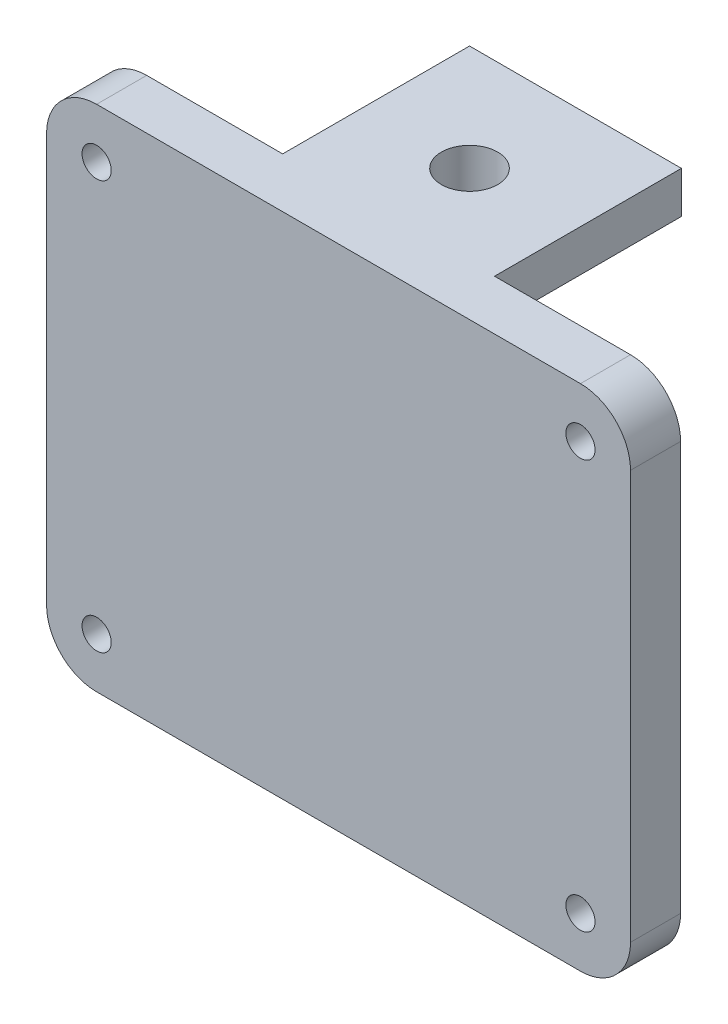
ISO-10303-21;
HEADER;
FILE_DESCRIPTION(('STEP AP214'),'2;1');
FILE_NAME('part.step','',(''),(''),'','','');
FILE_SCHEMA(('AUTOMOTIVE_DESIGN { 1 0 10303 214 1 1 1 1 }'));
ENDSEC;
DATA;
#1=APPLICATION_CONTEXT('core data for automotive mechanical design processes');
#2=APPLICATION_PROTOCOL_DEFINITION('international standard','automotive_design',2000,#1);
#3=PRODUCT_CONTEXT('',#1,'mechanical');
#4=PRODUCT('Part','Part','',(#3));
#5=PRODUCT_RELATED_PRODUCT_CATEGORY('part','',(#4));
#6=PRODUCT_DEFINITION_FORMATION('','',#4);
#7=PRODUCT_DEFINITION_CONTEXT('part definition',#1,'design');
#8=PRODUCT_DEFINITION('design','',#6,#7);
#9=PRODUCT_DEFINITION_SHAPE('','',#8);
#10=(LENGTH_UNIT() NAMED_UNIT(*) SI_UNIT(.MILLI.,.METRE.));
#11=(NAMED_UNIT(*) PLANE_ANGLE_UNIT() SI_UNIT($,.RADIAN.));
#12=(NAMED_UNIT(*) SI_UNIT($,.STERADIAN.) SOLID_ANGLE_UNIT());
#13=UNCERTAINTY_MEASURE_WITH_UNIT(LENGTH_MEASURE(1.E-05),#10,'distance_accuracy_value','');
#14=(GEOMETRIC_REPRESENTATION_CONTEXT(3) GLOBAL_UNCERTAINTY_ASSIGNED_CONTEXT((#13)) GLOBAL_UNIT_ASSIGNED_CONTEXT((#10,
#11,#12)) REPRESENTATION_CONTEXT('',''));
#15=CARTESIAN_POINT('',(0.,0.,0.));
#16=DIRECTION('',(0.,0.,1.));
#17=DIRECTION('',(1.,0.,0.));
#18=AXIS2_PLACEMENT_3D('',#15,#16,#17);
#19=CARTESIAN_POINT('',(12.7,5.,-12.7));
#20=DIRECTION('',(-1.,0.,0.));
#21=DIRECTION('',(0.,0.,1.));
#22=AXIS2_PLACEMENT_3D('',#19,#20,#21);
#23=PLANE('',#22);
#24=DIRECTION('',(0.,1.,0.));
#25=VECTOR('',#24,1.);
#26=CARTESIAN_POINT('',(12.7,5.,9.7));
#27=LINE('',#26,#25);
#28=CARTESIAN_POINT('',(12.7,0.,9.7));
#29=VERTEX_POINT('',#28);
#30=CARTESIAN_POINT('',(12.7,5.,9.7));
#31=VERTEX_POINT('',#30);
#32=EDGE_CURVE('E152',#29,#31,#27,.T.);
#33=ORIENTED_EDGE('',*,*,#32,.F.);
#34=DIRECTION('',(0.,0.,-1.));
#35=VECTOR('',#34,1.);
#36=CARTESIAN_POINT('',(12.7,0.,-12.7));
#37=LINE('',#36,#35);
#38=CARTESIAN_POINT('',(12.7,0.,-12.7));
#39=VERTEX_POINT('',#38);
#40=EDGE_CURVE('E137',#29,#39,#37,.T.);
#41=ORIENTED_EDGE('',*,*,#40,.T.);
#42=DIRECTION('',(0.,-1.,0.));
#43=VECTOR('',#42,1.);
#44=CARTESIAN_POINT('',(12.7,5.,-12.7));
#45=LINE('',#44,#43);
#46=CARTESIAN_POINT('',(12.7,5.,-12.7));
#47=VERTEX_POINT('',#46);
#48=EDGE_CURVE('E166',#47,#39,#45,.T.);
#49=ORIENTED_EDGE('',*,*,#48,.F.);
#50=DIRECTION('',(0.,0.,-1.));
#51=VECTOR('',#50,1.);
#52=CARTESIAN_POINT('',(12.7,5.,-12.7));
#53=LINE('',#52,#51);
#54=EDGE_CURVE('E153',#31,#47,#53,.T.);
#55=ORIENTED_EDGE('',*,*,#54,.F.);
#56=EDGE_LOOP('',(#33,#41,#49,#55));
#57=FACE_BOUND('',#56,.T.);
#58=ADVANCED_FACE('F47',(#57),#23,.F.);
#59=CARTESIAN_POINT('',(-12.7,5.,-12.7));
#60=DIRECTION('',(1.,0.,0.));
#61=DIRECTION('',(0.,0.,-1.));
#62=AXIS2_PLACEMENT_3D('',#59,#60,#61);
#63=PLANE('',#62);
#64=DIRECTION('',(0.,-1.,0.));
#65=VECTOR('',#64,1.);
#66=CARTESIAN_POINT('',(-12.7,5.,9.7));
#67=LINE('',#66,#65);
#68=CARTESIAN_POINT('',(-12.7,5.,9.7));
#69=VERTEX_POINT('',#68);
#70=CARTESIAN_POINT('',(-12.7,0.,9.7));
#71=VERTEX_POINT('',#70);
#72=EDGE_CURVE('E158',#69,#71,#67,.T.);
#73=ORIENTED_EDGE('',*,*,#72,.F.);
#74=DIRECTION('',(0.,0.,1.));
#75=VECTOR('',#74,1.);
#76=CARTESIAN_POINT('',(-12.7,5.,-12.7));
#77=LINE('',#76,#75);
#78=CARTESIAN_POINT('',(-12.7,5.,-12.7));
#79=VERTEX_POINT('',#78);
#80=EDGE_CURVE('E279',#79,#69,#77,.T.);
#81=ORIENTED_EDGE('',*,*,#80,.F.);
#82=DIRECTION('',(0.,-1.,0.));
#83=VECTOR('',#82,1.);
#84=CARTESIAN_POINT('',(-12.7,5.,-12.7));
#85=LINE('',#84,#83);
#86=CARTESIAN_POINT('',(-12.7,0.,-12.7));
#87=VERTEX_POINT('',#86);
#88=EDGE_CURVE('E172',#79,#87,#85,.T.);
#89=ORIENTED_EDGE('',*,*,#88,.T.);
#90=DIRECTION('',(0.,0.,1.));
#91=VECTOR('',#90,1.);
#92=CARTESIAN_POINT('',(-12.7,0.,-12.7));
#93=LINE('',#92,#91);
#94=EDGE_CURVE('E276',#87,#71,#93,.T.);
#95=ORIENTED_EDGE('',*,*,#94,.T.);
#96=EDGE_LOOP('',(#73,#81,#89,#95));
#97=FACE_BOUND('',#96,.T.);
#98=ADVANCED_FACE('F290',(#97),#63,.F.);
#99=CARTESIAN_POINT('',(0.,0.,0.));
#100=DIRECTION('',(0.,1.,0.));
#101=DIRECTION('',(0.,0.,1.));
#102=AXIS2_PLACEMENT_3D('',#99,#100,#101);
#103=PLANE('',#102);
#104=CARTESIAN_POINT('',(0.,0.,0.));
#105=DIRECTION('',(0.,1.,0.));
#106=DIRECTION('',(0.,0.,1.));
#107=AXIS2_PLACEMENT_3D('',#104,#105,#106);
#108=CIRCLE('',#107,3.37819999999999);
#109=CARTESIAN_POINT('',(0.,0.,3.37819999999999));
#110=VERTEX_POINT('',#109);
#111=EDGE_CURVE('E149',#110,#110,#108,.T.);
#112=ORIENTED_EDGE('',*,*,#111,.T.);
#113=EDGE_LOOP('',(#112));
#114=FACE_BOUND('',#113,.T.);
#115=DIRECTION('',(1.,0.,0.));
#116=VECTOR('',#115,1.);
#117=CARTESIAN_POINT('',(0.,0.,9.7));
#118=LINE('',#117,#116);
#119=EDGE_CURVE('E142',#71,#29,#118,.T.);
#120=ORIENTED_EDGE('',*,*,#119,.F.);
#121=ORIENTED_EDGE('',*,*,#94,.F.);
#122=DIRECTION('',(-1.,0.,0.));
#123=VECTOR('',#122,1.);
#124=CARTESIAN_POINT('',(-12.7,0.,-12.7));
#125=LINE('',#124,#123);
#126=EDGE_CURVE('E144',#39,#87,#125,.T.);
#127=ORIENTED_EDGE('',*,*,#126,.F.);
#128=ORIENTED_EDGE('',*,*,#40,.F.);
#129=EDGE_LOOP('',(#120,#121,#127,#128));
#130=FACE_BOUND('',#129,.T.);
#131=ADVANCED_FACE('F139',(#114,#130),#103,.F.);
#132=CARTESIAN_POINT('',(-12.7,5.,-12.7));
#133=DIRECTION('',(0.,0.,1.));
#134=DIRECTION('',(1.,0.,0.));
#135=AXIS2_PLACEMENT_3D('',#132,#133,#134);
#136=PLANE('',#135);
#137=ORIENTED_EDGE('',*,*,#126,.T.);
#138=ORIENTED_EDGE('',*,*,#88,.F.);
#139=DIRECTION('',(-1.,0.,0.));
#140=VECTOR('',#139,1.);
#141=CARTESIAN_POINT('',(-12.7,5.,-12.7));
#142=LINE('',#141,#140);
#143=EDGE_CURVE('E275',#47,#79,#142,.T.);
#144=ORIENTED_EDGE('',*,*,#143,.F.);
#145=ORIENTED_EDGE('',*,*,#48,.T.);
#146=EDGE_LOOP('',(#137,#138,#144,#145));
#147=FACE_BOUND('',#146,.T.);
#148=ADVANCED_FACE('F293',(#147),#136,.F.);
#149=CARTESIAN_POINT('',(0.,5.,0.));
#150=DIRECTION('',(0.,1.,0.));
#151=DIRECTION('',(0.,0.,1.));
#152=AXIS2_PLACEMENT_3D('',#149,#150,#151);
#153=PLANE('',#152);
#154=DIRECTION('',(1.,0.,0.));
#155=VECTOR('',#154,1.);
#156=CARTESIAN_POINT('',(0.,5.,15.7));
#157=LINE('',#156,#155);
#158=CARTESIAN_POINT('',(-29.,5.,15.7));
#159=VERTEX_POINT('',#158);
#160=CARTESIAN_POINT('',(29.,5.,15.7));
#161=VERTEX_POINT('',#160);
#162=EDGE_CURVE('E222',#159,#161,#157,.T.);
#163=ORIENTED_EDGE('',*,*,#162,.T.);
#164=DIRECTION('',(0.,0.,1.));
#165=VECTOR('',#164,1.);
#166=CARTESIAN_POINT('',(29.,5.,0.));
#167=LINE('',#166,#165);
#168=CARTESIAN_POINT('',(29.,5.,9.7));
#169=VERTEX_POINT('',#168);
#170=EDGE_CURVE('E11',#161,#169,#167,.F.);
#171=ORIENTED_EDGE('',*,*,#170,.T.);
#172=DIRECTION('',(1.,0.,0.));
#173=VECTOR('',#172,1.);
#174=CARTESIAN_POINT('',(0.,5.,9.7));
#175=LINE('',#174,#173);
#176=EDGE_CURVE('E264',#31,#169,#175,.T.);
#177=ORIENTED_EDGE('',*,*,#176,.F.);
#178=ORIENTED_EDGE('',*,*,#54,.T.);
#179=ORIENTED_EDGE('',*,*,#143,.T.);
#180=ORIENTED_EDGE('',*,*,#80,.T.);
#181=CARTESIAN_POINT('',(-29.,5.,9.7));
#182=VERTEX_POINT('',#181);
#183=EDGE_CURVE('E225',#182,#69,#175,.T.);
#184=ORIENTED_EDGE('',*,*,#183,.F.);
#185=DIRECTION('',(0.,0.,1.));
#186=VECTOR('',#185,1.);
#187=CARTESIAN_POINT('',(-29.,5.,15.7));
#188=LINE('',#187,#186);
#189=EDGE_CURVE('E56',#182,#159,#188,.T.);
#190=ORIENTED_EDGE('',*,*,#189,.T.);
#191=EDGE_LOOP('',(#163,#171,#177,#178,#179,#180,#184,#190));
#192=FACE_BOUND('',#191,.T.);
#193=CARTESIAN_POINT('',(0.,5.,0.));
#194=DIRECTION('',(0.,1.,0.));
#195=DIRECTION('',(0.,0.,1.));
#196=AXIS2_PLACEMENT_3D('',#193,#194,#195);
#197=CIRCLE('',#196,3.37819999999999);
#198=CARTESIAN_POINT('',(0.,5.,3.37819999999999));
#199=VERTEX_POINT('',#198);
#200=EDGE_CURVE('E157',#199,#199,#197,.T.);
#201=ORIENTED_EDGE('',*,*,#200,.F.);
#202=EDGE_LOOP('',(#201));
#203=FACE_BOUND('',#202,.T.);
#204=ADVANCED_FACE('F220',(#192,#203),#153,.T.);
#205=CARTESIAN_POINT('',(0.,5.,0.));
#206=DIRECTION('',(0.,1.,0.));
#207=DIRECTION('',(0.,0.,1.));
#208=AXIS2_PLACEMENT_3D('',#205,#206,#207);
#209=CYLINDRICAL_SURFACE('',#208,3.37819999999999);
#210=ORIENTED_EDGE('',*,*,#111,.F.);
#211=EDGE_LOOP('',(#210));
#212=FACE_BOUND('',#211,.T.);
#213=ORIENTED_EDGE('',*,*,#200,.T.);
#214=EDGE_LOOP('',(#213));
#215=FACE_BOUND('',#214,.T.);
#216=ADVANCED_FACE('F388',(#212,#215),#209,.F.);
#217=CARTESIAN_POINT('',(0.,0.,9.7));
#218=DIRECTION('',(0.,0.,1.));
#219=DIRECTION('',(1.,0.,0.));
#220=AXIS2_PLACEMENT_3D('',#217,#218,#219);
#221=PLANE('',#220);
#222=CARTESIAN_POINT('',(-29.,-50.,9.7));
#223=DIRECTION('',(0.,0.,1.));
#224=DIRECTION('',(1.,0.,0.));
#225=AXIS2_PLACEMENT_3D('',#222,#223,#224);
#226=CIRCLE('',#225,1.75);
#227=CARTESIAN_POINT('',(-27.25,-50.,9.7));
#228=VERTEX_POINT('',#227);
#229=EDGE_CURVE('E310',#228,#228,#226,.T.);
#230=ORIENTED_EDGE('',*,*,#229,.T.);
#231=EDGE_LOOP('',(#230));
#232=FACE_BOUND('',#231,.T.);
#233=CARTESIAN_POINT('',(29.,-50.,9.7));
#234=DIRECTION('',(0.,0.,1.));
#235=DIRECTION('',(1.,0.,0.));
#236=AXIS2_PLACEMENT_3D('',#233,#234,#235);
#237=CIRCLE('',#236,1.75);
#238=CARTESIAN_POINT('',(30.75,-50.,9.7));
#239=VERTEX_POINT('',#238);
#240=EDGE_CURVE('E314',#239,#239,#237,.T.);
#241=ORIENTED_EDGE('',*,*,#240,.T.);
#242=EDGE_LOOP('',(#241));
#243=FACE_BOUND('',#242,.T.);
#244=CARTESIAN_POINT('',(29.,-1.,9.7));
#245=DIRECTION('',(0.,0.,1.));
#246=DIRECTION('',(1.,0.,0.));
#247=AXIS2_PLACEMENT_3D('',#244,#245,#246);
#248=CIRCLE('',#247,1.75);
#249=CARTESIAN_POINT('',(30.75,-1.,9.7));
#250=VERTEX_POINT('',#249);
#251=EDGE_CURVE('E317',#250,#250,#248,.T.);
#252=ORIENTED_EDGE('',*,*,#251,.T.);
#253=EDGE_LOOP('',(#252));
#254=FACE_BOUND('',#253,.T.);
#255=CARTESIAN_POINT('',(-29.,-1.,9.7));
#256=DIRECTION('',(0.,0.,1.));
#257=DIRECTION('',(1.,0.,0.));
#258=AXIS2_PLACEMENT_3D('',#255,#256,#257);
#259=CIRCLE('',#258,1.75);
#260=CARTESIAN_POINT('',(-27.25,-1.,9.7));
#261=VERTEX_POINT('',#260);
#262=EDGE_CURVE('E240',#261,#261,#259,.T.);
#263=ORIENTED_EDGE('',*,*,#262,.T.);
#264=EDGE_LOOP('',(#263));
#265=FACE_BOUND('',#264,.T.);
#266=DIRECTION('',(0.,1.,0.));
#267=VECTOR('',#266,1.);
#268=CARTESIAN_POINT('',(35.,0.,9.7));
#269=LINE('',#268,#267);
#270=CARTESIAN_POINT('',(35.,-50.,9.7));
#271=VERTEX_POINT('',#270);
#272=CARTESIAN_POINT('',(35.,-1.,9.7));
#273=VERTEX_POINT('',#272);
#274=EDGE_CURVE('E306',#271,#273,#269,.T.);
#275=ORIENTED_EDGE('',*,*,#274,.F.);
#276=CARTESIAN_POINT('',(29.,-50.,9.7));
#277=DIRECTION('',(0.,0.,1.));
#278=DIRECTION('',(1.,0.,0.));
#279=AXIS2_PLACEMENT_3D('',#276,#277,#278);
#280=CIRCLE('',#279,6.);
#281=CARTESIAN_POINT('',(29.,-56.,9.7));
#282=VERTEX_POINT('',#281);
#283=EDGE_CURVE('E206',#271,#282,#280,.F.);
#284=ORIENTED_EDGE('',*,*,#283,.T.);
#285=DIRECTION('',(1.,0.,0.));
#286=VECTOR('',#285,1.);
#287=CARTESIAN_POINT('',(0.,-56.,9.7));
#288=LINE('',#287,#286);
#289=CARTESIAN_POINT('',(-29.,-56.,9.7));
#290=VERTEX_POINT('',#289);
#291=EDGE_CURVE('E302',#290,#282,#288,.T.);
#292=ORIENTED_EDGE('',*,*,#291,.F.);
#293=CARTESIAN_POINT('',(-29.,-50.,9.7));
#294=DIRECTION('',(0.,0.,1.));
#295=DIRECTION('',(1.,0.,0.));
#296=AXIS2_PLACEMENT_3D('',#293,#294,#295);
#297=CIRCLE('',#296,6.);
#298=CARTESIAN_POINT('',(-35.,-50.,9.7));
#299=VERTEX_POINT('',#298);
#300=EDGE_CURVE('E203',#290,#299,#297,.F.);
#301=ORIENTED_EDGE('',*,*,#300,.T.);
#302=DIRECTION('',(0.,1.,0.));
#303=VECTOR('',#302,1.);
#304=CARTESIAN_POINT('',(-35.,0.,9.7));
#305=LINE('',#304,#303);
#306=CARTESIAN_POINT('',(-35.,-1.,9.7));
#307=VERTEX_POINT('',#306);
#308=EDGE_CURVE('E298',#299,#307,#305,.T.);
#309=ORIENTED_EDGE('',*,*,#308,.T.);
#310=CARTESIAN_POINT('',(-29.,-1.,9.7));
#311=DIRECTION('',(0.,0.,1.));
#312=DIRECTION('',(1.,0.,0.));
#313=AXIS2_PLACEMENT_3D('',#310,#311,#312);
#314=CIRCLE('',#313,6.);
#315=EDGE_CURVE('E63',#307,#182,#314,.F.);
#316=ORIENTED_EDGE('',*,*,#315,.T.);
#317=ORIENTED_EDGE('',*,*,#183,.T.);
#318=ORIENTED_EDGE('',*,*,#72,.T.);
#319=ORIENTED_EDGE('',*,*,#119,.T.);
#320=ORIENTED_EDGE('',*,*,#32,.T.);
#321=ORIENTED_EDGE('',*,*,#176,.T.);
#322=CARTESIAN_POINT('',(29.,-1.,9.7));
#323=DIRECTION('',(0.,0.,1.));
#324=DIRECTION('',(1.,0.,0.));
#325=AXIS2_PLACEMENT_3D('',#322,#323,#324);
#326=CIRCLE('',#325,6.);
#327=EDGE_CURVE('E200',#169,#273,#326,.F.);
#328=ORIENTED_EDGE('',*,*,#327,.T.);
#329=EDGE_LOOP('',(#275,#284,#292,#301,#309,#316,#317,#318,#319,#320,#321,#328));
#330=FACE_BOUND('',#329,.T.);
#331=ADVANCED_FACE('F162',(#232,#243,#254,#265,#330),#221,.F.);
#332=CARTESIAN_POINT('',(35.,0.,9.7));
#333=DIRECTION('',(1.,0.,0.));
#334=DIRECTION('',(0.,0.,-1.));
#335=AXIS2_PLACEMENT_3D('',#332,#333,#334);
#336=PLANE('',#335);
#337=DIRECTION('',(0.,1.,0.));
#338=VECTOR('',#337,1.);
#339=CARTESIAN_POINT('',(35.,0.,15.7));
#340=LINE('',#339,#338);
#341=CARTESIAN_POINT('',(35.,-50.,15.7));
#342=VERTEX_POINT('',#341);
#343=CARTESIAN_POINT('',(35.,-1.,15.7));
#344=VERTEX_POINT('',#343);
#345=EDGE_CURVE('E245',#342,#344,#340,.T.);
#346=ORIENTED_EDGE('',*,*,#345,.F.);
#347=DIRECTION('',(0.,0.,1.));
#348=VECTOR('',#347,1.);
#349=CARTESIAN_POINT('',(35.,-50.,9.7));
#350=LINE('',#349,#348);
#351=EDGE_CURVE('E195',#342,#271,#350,.F.);
#352=ORIENTED_EDGE('',*,*,#351,.T.);
#353=ORIENTED_EDGE('',*,*,#274,.T.);
#354=DIRECTION('',(0.,0.,1.));
#355=VECTOR('',#354,1.);
#356=CARTESIAN_POINT('',(35.,-1.,9.7));
#357=LINE('',#356,#355);
#358=EDGE_CURVE('E191',#273,#344,#357,.T.);
#359=ORIENTED_EDGE('',*,*,#358,.T.);
#360=EDGE_LOOP('',(#346,#352,#353,#359));
#361=FACE_BOUND('',#360,.T.);
#362=ADVANCED_FACE('F366',(#361),#336,.T.);
#363=CARTESIAN_POINT('',(0.,-56.,9.7));
#364=DIRECTION('',(0.,-1.,0.));
#365=DIRECTION('',(0.,0.,-1.));
#366=AXIS2_PLACEMENT_3D('',#363,#364,#365);
#367=PLANE('',#366);
#368=ORIENTED_EDGE('',*,*,#291,.T.);
#369=DIRECTION('',(0.,0.,1.));
#370=VECTOR('',#369,1.);
#371=CARTESIAN_POINT('',(29.,-56.,9.7));
#372=LINE('',#371,#370);
#373=CARTESIAN_POINT('',(29.,-56.,15.7));
#374=VERTEX_POINT('',#373);
#375=EDGE_CURVE('E170',#282,#374,#372,.T.);
#376=ORIENTED_EDGE('',*,*,#375,.T.);
#377=DIRECTION('',(1.,0.,0.));
#378=VECTOR('',#377,1.);
#379=CARTESIAN_POINT('',(0.,-56.,15.7));
#380=LINE('',#379,#378);
#381=CARTESIAN_POINT('',(-29.,-56.,15.7));
#382=VERTEX_POINT('',#381);
#383=EDGE_CURVE('E237',#382,#374,#380,.T.);
#384=ORIENTED_EDGE('',*,*,#383,.F.);
#385=DIRECTION('',(0.,0.,1.));
#386=VECTOR('',#385,1.);
#387=CARTESIAN_POINT('',(-29.,-56.,9.7));
#388=LINE('',#387,#386);
#389=EDGE_CURVE('E165',#382,#290,#388,.F.);
#390=ORIENTED_EDGE('',*,*,#389,.T.);
#391=EDGE_LOOP('',(#368,#376,#384,#390));
#392=FACE_BOUND('',#391,.T.);
#393=ADVANCED_FACE('F372',(#392),#367,.T.);
#394=CARTESIAN_POINT('',(29.,-1.,9.7));
#395=DIRECTION('',(0.,0.,1.));
#396=DIRECTION('',(1.,0.,0.));
#397=AXIS2_PLACEMENT_3D('',#394,#395,#396);
#398=CYLINDRICAL_SURFACE('',#397,1.75);
#399=ORIENTED_EDGE('',*,*,#251,.F.);
#400=EDGE_LOOP('',(#399));
#401=FACE_BOUND('',#400,.T.);
#402=CARTESIAN_POINT('',(29.,-1.,15.7));
#403=DIRECTION('',(0.,0.,1.));
#404=DIRECTION('',(1.,0.,0.));
#405=AXIS2_PLACEMENT_3D('',#402,#403,#404);
#406=CIRCLE('',#405,1.75);
#407=CARTESIAN_POINT('',(30.75,-1.,15.7));
#408=VERTEX_POINT('',#407);
#409=EDGE_CURVE('E256',#408,#408,#406,.T.);
#410=ORIENTED_EDGE('',*,*,#409,.T.);
#411=EDGE_LOOP('',(#410));
#412=FACE_BOUND('',#411,.T.);
#413=ADVANCED_FACE('F460',(#401,#412),#398,.F.);
#414=CARTESIAN_POINT('',(29.,-50.,9.7));
#415=DIRECTION('',(0.,0.,1.));
#416=DIRECTION('',(1.,0.,0.));
#417=AXIS2_PLACEMENT_3D('',#414,#415,#416);
#418=CYLINDRICAL_SURFACE('',#417,1.75);
#419=ORIENTED_EDGE('',*,*,#240,.F.);
#420=EDGE_LOOP('',(#419));
#421=FACE_BOUND('',#420,.T.);
#422=CARTESIAN_POINT('',(29.,-50.,15.7));
#423=DIRECTION('',(0.,0.,1.));
#424=DIRECTION('',(1.,0.,0.));
#425=AXIS2_PLACEMENT_3D('',#422,#423,#424);
#426=CIRCLE('',#425,1.75);
#427=CARTESIAN_POINT('',(30.75,-50.,15.7));
#428=VERTEX_POINT('',#427);
#429=EDGE_CURVE('E252',#428,#428,#426,.T.);
#430=ORIENTED_EDGE('',*,*,#429,.T.);
#431=EDGE_LOOP('',(#430));
#432=FACE_BOUND('',#431,.T.);
#433=ADVANCED_FACE('F382',(#421,#432),#418,.F.);
#434=CARTESIAN_POINT('',(-29.,-50.,9.7));
#435=DIRECTION('',(0.,0.,1.));
#436=DIRECTION('',(1.,0.,0.));
#437=AXIS2_PLACEMENT_3D('',#434,#435,#436);
#438=CYLINDRICAL_SURFACE('',#437,1.75);
#439=ORIENTED_EDGE('',*,*,#229,.F.);
#440=EDGE_LOOP('',(#439));
#441=FACE_BOUND('',#440,.T.);
#442=CARTESIAN_POINT('',(-29.,-50.,15.7));
#443=DIRECTION('',(0.,0.,1.));
#444=DIRECTION('',(1.,0.,0.));
#445=AXIS2_PLACEMENT_3D('',#442,#443,#444);
#446=CIRCLE('',#445,1.75);
#447=CARTESIAN_POINT('',(-27.25,-50.,15.7));
#448=VERTEX_POINT('',#447);
#449=EDGE_CURVE('E248',#448,#448,#446,.T.);
#450=ORIENTED_EDGE('',*,*,#449,.T.);
#451=EDGE_LOOP('',(#450));
#452=FACE_BOUND('',#451,.T.);
#453=ADVANCED_FACE('F376',(#441,#452),#438,.F.);
#454=CARTESIAN_POINT('',(-35.,0.,9.7));
#455=DIRECTION('',(1.,0.,0.));
#456=DIRECTION('',(0.,0.,-1.));
#457=AXIS2_PLACEMENT_3D('',#454,#455,#456);
#458=PLANE('',#457);
#459=ORIENTED_EDGE('',*,*,#308,.F.);
#460=DIRECTION('',(0.,0.,1.));
#461=VECTOR('',#460,1.);
#462=CARTESIAN_POINT('',(-35.,-50.,15.7));
#463=LINE('',#462,#461);
#464=CARTESIAN_POINT('',(-35.,-50.,15.7));
#465=VERTEX_POINT('',#464);
#466=EDGE_CURVE('E211',#299,#465,#463,.T.);
#467=ORIENTED_EDGE('',*,*,#466,.T.);
#468=DIRECTION('',(0.,1.,0.));
#469=VECTOR('',#468,1.);
#470=CARTESIAN_POINT('',(-35.,0.,15.7));
#471=LINE('',#470,#469);
#472=CARTESIAN_POINT('',(-35.,-1.,15.7));
#473=VERTEX_POINT('',#472);
#474=EDGE_CURVE('E234',#465,#473,#471,.T.);
#475=ORIENTED_EDGE('',*,*,#474,.T.);
#476=DIRECTION('',(0.,0.,1.));
#477=VECTOR('',#476,1.);
#478=CARTESIAN_POINT('',(-35.,-1.,9.7));
#479=LINE('',#478,#477);
#480=EDGE_CURVE('E71',#473,#307,#479,.F.);
#481=ORIENTED_EDGE('',*,*,#480,.T.);
#482=EDGE_LOOP('',(#459,#467,#475,#481));
#483=FACE_BOUND('',#482,.T.);
#484=ADVANCED_FACE('F330',(#483),#458,.F.);
#485=CARTESIAN_POINT('',(-29.,-1.,9.7));
#486=DIRECTION('',(0.,0.,1.));
#487=DIRECTION('',(1.,0.,0.));
#488=AXIS2_PLACEMENT_3D('',#485,#486,#487);
#489=CYLINDRICAL_SURFACE('',#488,1.75);
#490=ORIENTED_EDGE('',*,*,#262,.F.);
#491=EDGE_LOOP('',(#490));
#492=FACE_BOUND('',#491,.T.);
#493=CARTESIAN_POINT('',(-29.,-1.,15.7));
#494=DIRECTION('',(0.,0.,1.));
#495=DIRECTION('',(1.,0.,0.));
#496=AXIS2_PLACEMENT_3D('',#493,#494,#495);
#497=CIRCLE('',#496,1.75);
#498=CARTESIAN_POINT('',(-27.25,-1.,15.7));
#499=VERTEX_POINT('',#498);
#500=EDGE_CURVE('E260',#499,#499,#497,.T.);
#501=ORIENTED_EDGE('',*,*,#500,.T.);
#502=EDGE_LOOP('',(#501));
#503=FACE_BOUND('',#502,.T.);
#504=ADVANCED_FACE('F327',(#492,#503),#489,.F.);
#505=CARTESIAN_POINT('',(0.,0.,15.7));
#506=DIRECTION('',(0.,0.,1.));
#507=DIRECTION('',(1.,0.,0.));
#508=AXIS2_PLACEMENT_3D('',#505,#506,#507);
#509=PLANE('',#508);
#510=ORIENTED_EDGE('',*,*,#383,.T.);
#511=CARTESIAN_POINT('',(29.,-50.,15.7));
#512=DIRECTION('',(0.,0.,1.));
#513=DIRECTION('',(1.,0.,0.));
#514=AXIS2_PLACEMENT_3D('',#511,#512,#513);
#515=CIRCLE('',#514,6.);
#516=EDGE_CURVE('E188',#374,#342,#515,.T.);
#517=ORIENTED_EDGE('',*,*,#516,.T.);
#518=ORIENTED_EDGE('',*,*,#345,.T.);
#519=CARTESIAN_POINT('',(29.,-1.,15.7));
#520=DIRECTION('',(0.,0.,1.));
#521=DIRECTION('',(1.,0.,0.));
#522=AXIS2_PLACEMENT_3D('',#519,#520,#521);
#523=CIRCLE('',#522,6.);
#524=EDGE_CURVE('E182',#344,#161,#523,.T.);
#525=ORIENTED_EDGE('',*,*,#524,.T.);
#526=ORIENTED_EDGE('',*,*,#162,.F.);
#527=CARTESIAN_POINT('',(-29.,-1.,15.7));
#528=DIRECTION('',(0.,0.,1.));
#529=DIRECTION('',(1.,0.,0.));
#530=AXIS2_PLACEMENT_3D('',#527,#528,#529);
#531=CIRCLE('',#530,6.);
#532=EDGE_CURVE('E179',#159,#473,#531,.T.);
#533=ORIENTED_EDGE('',*,*,#532,.T.);
#534=ORIENTED_EDGE('',*,*,#474,.F.);
#535=CARTESIAN_POINT('',(-29.,-50.,15.7));
#536=DIRECTION('',(0.,0.,1.));
#537=DIRECTION('',(1.,0.,0.));
#538=AXIS2_PLACEMENT_3D('',#535,#536,#537);
#539=CIRCLE('',#538,6.);
#540=EDGE_CURVE('E185',#465,#382,#539,.T.);
#541=ORIENTED_EDGE('',*,*,#540,.T.);
#542=EDGE_LOOP('',(#510,#517,#518,#525,#526,#533,#534,#541));
#543=FACE_BOUND('',#542,.T.);
#544=ORIENTED_EDGE('',*,*,#449,.F.);
#545=EDGE_LOOP('',(#544));
#546=FACE_BOUND('',#545,.T.);
#547=ORIENTED_EDGE('',*,*,#429,.F.);
#548=EDGE_LOOP('',(#547));
#549=FACE_BOUND('',#548,.T.);
#550=ORIENTED_EDGE('',*,*,#409,.F.);
#551=EDGE_LOOP('',(#550));
#552=FACE_BOUND('',#551,.T.);
#553=ORIENTED_EDGE('',*,*,#500,.F.);
#554=EDGE_LOOP('',(#553));
#555=FACE_BOUND('',#554,.T.);
#556=ADVANCED_FACE('F229',(#543,#546,#549,#552,#555),#509,.T.);
#557=CARTESIAN_POINT('',(29.,-50.,9.7));
#558=DIRECTION('',(0.,0.,1.));
#559=DIRECTION('',(1.,0.,0.));
#560=AXIS2_PLACEMENT_3D('',#557,#558,#559);
#561=CYLINDRICAL_SURFACE('',#560,6.);
#562=ORIENTED_EDGE('',*,*,#283,.F.);
#563=ORIENTED_EDGE('',*,*,#351,.F.);
#564=ORIENTED_EDGE('',*,*,#516,.F.);
#565=ORIENTED_EDGE('',*,*,#375,.F.);
#566=EDGE_LOOP('',(#562,#563,#564,#565));
#567=FACE_BOUND('',#566,.T.);
#568=ADVANCED_FACE('F335',(#567),#561,.T.);
#569=CARTESIAN_POINT('',(-29.,-50.,9.7));
#570=DIRECTION('',(0.,0.,-1.));
#571=DIRECTION('',(-1.,0.,0.));
#572=AXIS2_PLACEMENT_3D('',#569,#570,#571);
#573=CYLINDRICAL_SURFACE('',#572,6.);
#574=ORIENTED_EDGE('',*,*,#300,.F.);
#575=ORIENTED_EDGE('',*,*,#389,.F.);
#576=ORIENTED_EDGE('',*,*,#540,.F.);
#577=ORIENTED_EDGE('',*,*,#466,.F.);
#578=EDGE_LOOP('',(#574,#575,#576,#577));
#579=FACE_BOUND('',#578,.T.);
#580=ADVANCED_FACE('F341',(#579),#573,.T.);
#581=CARTESIAN_POINT('',(29.,-1.,9.7));
#582=DIRECTION('',(0.,0.,1.));
#583=DIRECTION('',(1.,0.,0.));
#584=AXIS2_PLACEMENT_3D('',#581,#582,#583);
#585=CYLINDRICAL_SURFACE('',#584,6.);
#586=ORIENTED_EDGE('',*,*,#327,.F.);
#587=ORIENTED_EDGE('',*,*,#170,.F.);
#588=ORIENTED_EDGE('',*,*,#524,.F.);
#589=ORIENTED_EDGE('',*,*,#358,.F.);
#590=EDGE_LOOP('',(#586,#587,#588,#589));
#591=FACE_BOUND('',#590,.T.);
#592=ADVANCED_FACE('F355',(#591),#585,.T.);
#593=CARTESIAN_POINT('',(-29.,-1.,0.));
#594=DIRECTION('',(0.,0.,-1.));
#595=DIRECTION('',(-1.,0.,0.));
#596=AXIS2_PLACEMENT_3D('',#593,#594,#595);
#597=CYLINDRICAL_SURFACE('',#596,6.);
#598=ORIENTED_EDGE('',*,*,#315,.F.);
#599=ORIENTED_EDGE('',*,*,#480,.F.);
#600=ORIENTED_EDGE('',*,*,#532,.F.);
#601=ORIENTED_EDGE('',*,*,#189,.F.);
#602=EDGE_LOOP('',(#598,#599,#600,#601));
#603=FACE_BOUND('',#602,.T.);
#604=ADVANCED_FACE('F49',(#603),#597,.T.);
#605=CLOSED_SHELL('',(#58,#98,#131,#148,#204,#216,#331,#362,#393,#413,#433,#453,#484,#504,#556,
#568,#580,#592,#604));
#606=MANIFOLD_SOLID_BREP('B2',#605);
#607=ADVANCED_BREP_SHAPE_REPRESENTATION('',(#18,#606),#14);
#608=SHAPE_DEFINITION_REPRESENTATION(#9,#607);
ENDSEC;
END-ISO-10303-21;
